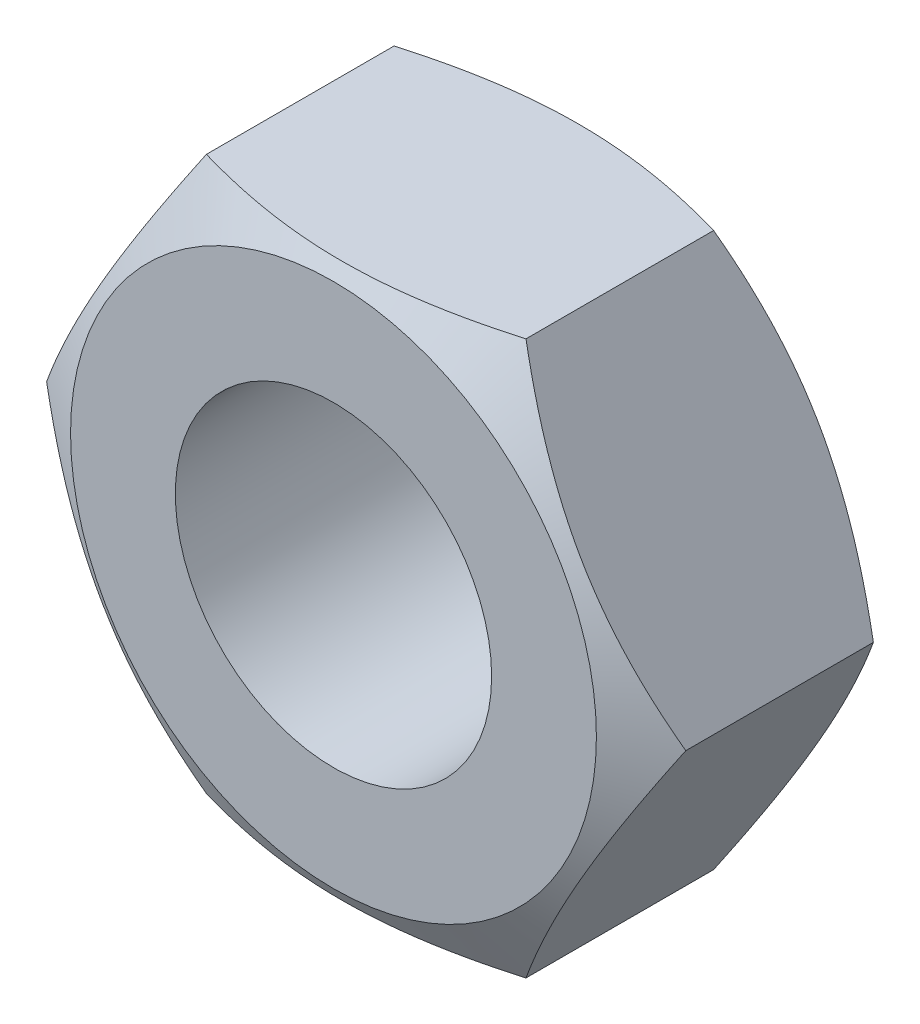
ISO-10303-21;
HEADER;
FILE_DESCRIPTION(('STEP AP214'),'2;1');
FILE_NAME('part.step','',(''),(''),'','','');
FILE_SCHEMA(('AUTOMOTIVE_DESIGN { 1 0 10303 214 1 1 1 1 }'));
ENDSEC;
DATA;
#1=APPLICATION_CONTEXT('core data for automotive mechanical design processes');
#2=APPLICATION_PROTOCOL_DEFINITION('international standard','automotive_design',2000,#1);
#3=PRODUCT_CONTEXT('',#1,'mechanical');
#4=PRODUCT('Part','Part','',(#3));
#5=PRODUCT_RELATED_PRODUCT_CATEGORY('part','',(#4));
#6=PRODUCT_DEFINITION_FORMATION('','',#4);
#7=PRODUCT_DEFINITION_CONTEXT('part definition',#1,'design');
#8=PRODUCT_DEFINITION('design','',#6,#7);
#9=PRODUCT_DEFINITION_SHAPE('','',#8);
#10=(LENGTH_UNIT() NAMED_UNIT(*) SI_UNIT(.MILLI.,.METRE.));
#11=(NAMED_UNIT(*) PLANE_ANGLE_UNIT() SI_UNIT($,.RADIAN.));
#12=(NAMED_UNIT(*) SI_UNIT($,.STERADIAN.) SOLID_ANGLE_UNIT());
#13=UNCERTAINTY_MEASURE_WITH_UNIT(LENGTH_MEASURE(1.E-05),#10,'distance_accuracy_value','');
#14=(GEOMETRIC_REPRESENTATION_CONTEXT(3) GLOBAL_UNCERTAINTY_ASSIGNED_CONTEXT((#13)) GLOBAL_UNIT_ASSIGNED_CONTEXT((#10,
#11,#12)) REPRESENTATION_CONTEXT('',''));
#15=CARTESIAN_POINT('',(0.,0.,0.));
#16=DIRECTION('',(0.,0.,1.));
#17=DIRECTION('',(1.,0.,0.));
#18=AXIS2_PLACEMENT_3D('',#15,#16,#17);
#19=CARTESIAN_POINT('',(4.04145188432738,0.,-3.2));
#20=DIRECTION('',(0.866025403784439,0.5,0.));
#21=DIRECTION('',(-0.5,0.866025403784439,0.));
#22=AXIS2_PLACEMENT_3D('',#19,#20,#21);
#23=PLANE('',#22);
#24=CARTESIAN_POINT('',(4.04156735438122,-0.000200000000001401,-0.413710357801552));
#25=CARTESIAN_POINT('',(3.9527667384984,0.153607178452448,-0.362422086098165));
#26=CARTESIAN_POINT('',(3.86319960126198,0.308742010834422,-0.315777250924379));
#27=CARTESIAN_POINT('',(3.68251437287562,0.621698006576779,-0.234358172641531));
#28=CARTESIAN_POINT('',(3.59139307116725,0.779524730787494,-0.199612732692744));
#29=CARTESIAN_POINT('',(3.41027974688034,1.09322221038012,-0.145526324291018));
#30=CARTESIAN_POINT('',(3.32031559103708,1.24904469916069,-0.125825383368564));
#31=CARTESIAN_POINT('',(3.13996396008051,1.56142288720537,-0.102306429845437));
#32=CARTESIAN_POINT('',(3.04957714051106,1.71797745103423,-0.0984689416537477));
#33=CARTESIAN_POINT('',(2.88068384499777,2.01050921992099,-0.10645159898516));
#34=CARTESIAN_POINT('',(2.80215208834114,2.1465302124579,-0.116311731177789));
#35=CARTESIAN_POINT('',(2.64560020969753,2.41768602028899,-0.147562764007586));
#36=CARTESIAN_POINT('',(2.5675806292065,2.55281989768468,-0.16896434039398));
#37=CARTESIAN_POINT('',(2.41070596159678,2.82453479240518,-0.222466704988759));
#38=CARTESIAN_POINT('',(2.33187072981463,2.96108141927833,-0.254794291553269));
#39=CARTESIAN_POINT('',(2.17537608630783,3.2321380929445,-0.328165230916176));
#40=CARTESIAN_POINT('',(2.09771466960098,3.36665161246854,-0.369191343678048));
#41=CARTESIAN_POINT('',(2.02061047210985,3.5002,-0.413710357801553));
#42=B_SPLINE_CURVE_WITH_KNOTS('',3,(#24,#25,#26,#27,#28,#29,#30,#31,#32,#33,#34,#35,#36,#37,#38,
#39,#40,#41),.UNSPECIFIED.,.F.,.F.,(4,2,2,2,2,2,2,2,4),(0.,0.554793832886253,1.11092123814984,
1.65328467083218,2.19498204478403,2.6666513085086,3.13875761298267,3.6213361260051,
4.10296698719187),.UNSPECIFIED.);
#43=CARTESIAN_POINT('',(4.04145188432738,0.,-0.413643688277824));
#44=VERTEX_POINT('',#43);
#45=CARTESIAN_POINT('',(2.02072594216369,3.5,-0.413643688277825));
#46=VERTEX_POINT('',#45);
#47=EDGE_CURVE('E54',#44,#46,#42,.T.);
#48=ORIENTED_EDGE('',*,*,#47,.F.);
#49=DIRECTION('',(0.,0.,1.));
#50=VECTOR('',#49,1.);
#51=CARTESIAN_POINT('',(4.04145188432738,0.,-3.2));
#52=LINE('',#51,#50);
#53=CARTESIAN_POINT('',(4.04145188432738,0.,-2.78635631172218));
#54=VERTEX_POINT('',#53);
#55=EDGE_CURVE('E13',#54,#44,#52,.T.);
#56=ORIENTED_EDGE('',*,*,#55,.F.);
#57=CARTESIAN_POINT('',(4.04156735438122,-0.000200000000001387,-2.78628964219845));
#58=CARTESIAN_POINT('',(3.9527667384984,0.153607178452448,-2.83757791390184));
#59=CARTESIAN_POINT('',(3.86319960126198,0.308742010834422,-2.88422274907562));
#60=CARTESIAN_POINT('',(3.68251437287562,0.621698006576779,-2.96564182735847));
#61=CARTESIAN_POINT('',(3.59139307116725,0.779524730787494,-3.00038726730726));
#62=CARTESIAN_POINT('',(3.41027974688034,1.09322221038012,-3.05447367570898));
#63=CARTESIAN_POINT('',(3.32031559103708,1.24904469916069,-3.07417461663144));
#64=CARTESIAN_POINT('',(3.13996396008051,1.56142288720537,-3.09769357015456));
#65=CARTESIAN_POINT('',(3.04957714051106,1.71797745103423,-3.10153105834625));
#66=CARTESIAN_POINT('',(2.88068384499777,2.01050921992099,-3.09354840101484));
#67=CARTESIAN_POINT('',(2.80215208834114,2.1465302124579,-3.08368826882221));
#68=CARTESIAN_POINT('',(2.64560020969753,2.41768602028899,-3.05243723599241));
#69=CARTESIAN_POINT('',(2.56758062920649,2.55281989768468,-3.03103565960602));
#70=CARTESIAN_POINT('',(2.41070596159678,2.82453479240518,-2.97753329501124));
#71=CARTESIAN_POINT('',(2.33187072981463,2.96108141927833,-2.94520570844673));
#72=CARTESIAN_POINT('',(2.17537608630783,3.2321380929445,-2.87183476908382));
#73=CARTESIAN_POINT('',(2.09771466960098,3.36665161246854,-2.83080865632195));
#74=CARTESIAN_POINT('',(2.02061047210985,3.5002,-2.78628964219845));
#75=B_SPLINE_CURVE_WITH_KNOTS('',3,(#57,#58,#59,#60,#61,#62,#63,#64,#65,#66,#67,#68,#69,#70,#71,
#72,#73,#74),.UNSPECIFIED.,.F.,.F.,(4,2,2,2,2,2,2,2,4),(0.,0.554793832886253,1.11092123814984,
1.65328467083218,2.19498204478403,2.6666513085086,3.13875761298267,3.6213361260051,
4.10296698719187),.UNSPECIFIED.);
#76=CARTESIAN_POINT('',(2.02072594216369,3.5,-2.78635631172218));
#77=VERTEX_POINT('',#76);
#78=EDGE_CURVE('E123',#54,#77,#75,.T.);
#79=ORIENTED_EDGE('',*,*,#78,.T.);
#80=DIRECTION('',(0.,0.,1.));
#81=VECTOR('',#80,1.);
#82=CARTESIAN_POINT('',(2.02072594216369,3.5,-3.2));
#83=LINE('',#82,#81);
#84=EDGE_CURVE('E41',#77,#46,#83,.T.);
#85=ORIENTED_EDGE('',*,*,#84,.T.);
#86=EDGE_LOOP('',(#48,#56,#79,#85));
#87=FACE_BOUND('',#86,.T.);
#88=ADVANCED_FACE('F37',(#87),#23,.T.);
#89=CARTESIAN_POINT('',(2.02072594216369,-3.5,-3.2));
#90=DIRECTION('',(0.866025403784439,-0.5,0.));
#91=DIRECTION('',(0.5,0.866025403784439,0.));
#92=AXIS2_PLACEMENT_3D('',#89,#90,#91);
#93=PLANE('',#92);
#94=CARTESIAN_POINT('',(2.02061047210985,-3.5002,-0.413710357801553));
#95=CARTESIAN_POINT('',(2.10941108799267,-3.34639282154755,-0.362422086098166));
#96=CARTESIAN_POINT('',(2.19897822522909,-3.19125798916558,-0.315777250924379));
#97=CARTESIAN_POINT('',(2.37966345361545,-2.87830199342322,-0.234358172641531));
#98=CARTESIAN_POINT('',(2.47078475532382,-2.7204752692125,-0.199612732692744));
#99=CARTESIAN_POINT('',(2.65189807961073,-2.40677778961987,-0.145526324291019));
#100=CARTESIAN_POINT('',(2.74186223545399,-2.25095530083931,-0.125825383368564));
#101=CARTESIAN_POINT('',(2.92221386641055,-1.93857711279463,-0.102306429845437));
#102=CARTESIAN_POINT('',(3.01260068598001,-1.78202254896577,-0.0984689416537483));
#103=CARTESIAN_POINT('',(3.1814939814933,-1.48949078007901,-0.106451598985161));
#104=CARTESIAN_POINT('',(3.26002573814992,-1.3534697875421,-0.11631173117779));
#105=CARTESIAN_POINT('',(3.41657761679353,-1.08231397971101,-0.147562764007586));
#106=CARTESIAN_POINT('',(3.49459719728457,-0.947180102315319,-0.168964340393981));
#107=CARTESIAN_POINT('',(3.65147186489428,-0.675465207594818,-0.222466704988759));
#108=CARTESIAN_POINT('',(3.73030709667643,-0.538918580721666,-0.254794291553269));
#109=CARTESIAN_POINT('',(3.88680174018324,-0.2678619070555,-0.328165230916176));
#110=CARTESIAN_POINT('',(3.96446315689009,-0.133348387531465,-0.369191343678048));
#111=CARTESIAN_POINT('',(4.04156735438122,0.000199999999998272,-0.413710357801552));
#112=B_SPLINE_CURVE_WITH_KNOTS('',3,(#94,#95,#96,#97,#98,#99,#100,#101,#102,#103,#104,#105,#106,
#107,#108,#109,#110,#111),.UNSPECIFIED.,.F.,.F.,(4,2,2,2,2,2,2,2,4),(0.,0.554793832886254,
1.11092123814984,1.65328467083219,2.19498204478403,2.6666513085086,3.13875761298267,
3.62133612600509,4.10296698719187),.UNSPECIFIED.);
#113=CARTESIAN_POINT('',(2.02072594216369,-3.5,-0.413643688277825));
#114=VERTEX_POINT('',#113);
#115=EDGE_CURVE('E197',#114,#44,#112,.T.);
#116=ORIENTED_EDGE('',*,*,#115,.F.);
#117=DIRECTION('',(0.,0.,1.));
#118=VECTOR('',#117,1.);
#119=CARTESIAN_POINT('',(2.02072594216369,-3.5,-3.2));
#120=LINE('',#119,#118);
#121=CARTESIAN_POINT('',(2.02072594216369,-3.5,-2.78635631172218));
#122=VERTEX_POINT('',#121);
#123=EDGE_CURVE('E46',#122,#114,#120,.T.);
#124=ORIENTED_EDGE('',*,*,#123,.F.);
#125=CARTESIAN_POINT('',(2.02061047210985,-3.5002,-2.78628964219845));
#126=CARTESIAN_POINT('',(2.10941108799267,-3.34639282154755,-2.83757791390183));
#127=CARTESIAN_POINT('',(2.19897822522909,-3.19125798916558,-2.88422274907562));
#128=CARTESIAN_POINT('',(2.37966345361545,-2.87830199342322,-2.96564182735847));
#129=CARTESIAN_POINT('',(2.47078475532382,-2.7204752692125,-3.00038726730726));
#130=CARTESIAN_POINT('',(2.65189807961073,-2.40677778961987,-3.05447367570898));
#131=CARTESIAN_POINT('',(2.74186223545399,-2.25095530083931,-3.07417461663144));
#132=CARTESIAN_POINT('',(2.92221386641055,-1.93857711279463,-3.09769357015456));
#133=CARTESIAN_POINT('',(3.01260068598001,-1.78202254896577,-3.10153105834625));
#134=CARTESIAN_POINT('',(3.1814939814933,-1.48949078007901,-3.09354840101484));
#135=CARTESIAN_POINT('',(3.26002573814992,-1.35346978754209,-3.08368826882221));
#136=CARTESIAN_POINT('',(3.41657761679353,-1.08231397971101,-3.05243723599241));
#137=CARTESIAN_POINT('',(3.49459719728457,-0.947180102315318,-3.03103565960602));
#138=CARTESIAN_POINT('',(3.65147186489428,-0.675465207594818,-2.97753329501124));
#139=CARTESIAN_POINT('',(3.73030709667643,-0.538918580721666,-2.94520570844673));
#140=CARTESIAN_POINT('',(3.88680174018324,-0.2678619070555,-2.87183476908382));
#141=CARTESIAN_POINT('',(3.96446315689009,-0.133348387531465,-2.83080865632195));
#142=CARTESIAN_POINT('',(4.04156735438122,0.00019999999999828,-2.78628964219845));
#143=B_SPLINE_CURVE_WITH_KNOTS('',3,(#125,#126,#127,#128,#129,#130,#131,#132,#133,#134,#135,
#136,#137,#138,#139,#140,#141,#142),.UNSPECIFIED.,.F.,.F.,(4,2,2,2,2,2,2,2,4),(0.,
0.554793832886253,1.11092123814984,1.65328467083219,2.19498204478403,2.6666513085086,
3.13875761298267,3.62133612600509,4.10296698719187),.UNSPECIFIED.);
#144=EDGE_CURVE('E133',#122,#54,#143,.T.);
#145=ORIENTED_EDGE('',*,*,#144,.T.);
#146=ORIENTED_EDGE('',*,*,#55,.T.);
#147=EDGE_LOOP('',(#116,#124,#145,#146));
#148=FACE_BOUND('',#147,.T.);
#149=ADVANCED_FACE('F182',(#148),#93,.T.);
#150=CARTESIAN_POINT('',(2.02072594216369,-3.5,-3.2));
#151=DIRECTION('',(0.,1.,0.));
#152=DIRECTION('',(0.,0.,1.));
#153=AXIS2_PLACEMENT_3D('',#150,#151,#152);
#154=PLANE('',#153);
#155=ORIENTED_EDGE('',*,*,#123,.T.);
#156=CARTESIAN_POINT('',(-5.50115624921716,-3.5,-1.84473683088568));
#157=CARTESIAN_POINT('',(-5.3476336728648,-3.5,-1.76997306111353));
#158=CARTESIAN_POINT('',(-5.19376639336898,-3.5,-1.69590536818078));
#159=CARTESIAN_POINT('',(-4.88515934110991,-3.5,-1.54955229395094));
#160=CARTESIAN_POINT('',(-4.73041944168447,-3.5,-1.47726718003009));
#161=CARTESIAN_POINT('',(-4.41912167760108,-3.5,-1.33452141460849));
#162=CARTESIAN_POINT('',(-4.26255854262694,-3.5,-1.26407221808801));
#163=CARTESIAN_POINT('',(-3.94821210106243,-3.5,-1.12596137379611));
#164=CARTESIAN_POINT('',(-3.79042885049213,-3.5,-1.05829959893573));
#165=CARTESIAN_POINT('',(-3.46807643943082,-3.5,-0.924287699925451));
#166=CARTESIAN_POINT('',(-3.3034571173953,-3.5,-0.858057594815772));
#167=CARTESIAN_POINT('',(-2.9723198837569,-3.5,-0.73043491920668));
#168=CARTESIAN_POINT('',(-2.8058017655431,-3.5,-0.669042881006884));
#169=CARTESIAN_POINT('',(-2.4708904779313,-3.5,-0.552654162670015));
#170=CARTESIAN_POINT('',(-2.30250163386854,-3.5,-0.497645157822716));
#171=CARTESIAN_POINT('',(-1.96330962749539,-3.5,-0.395738864286392));
#172=CARTESIAN_POINT('',(-1.79250721990682,-3.5,-0.348839098007306));
#173=CARTESIAN_POINT('',(-1.44932740892957,-3.5,-0.2655998480158));
#174=CARTESIAN_POINT('',(-1.27696441523268,-3.5,-0.22920202853296));
#175=CARTESIAN_POINT('',(-0.930020617319458,-3.5,-0.168980201444807));
#176=CARTESIAN_POINT('',(-0.755440055628397,-3.5,-0.145154830768674));
#177=CARTESIAN_POINT('',(-0.407243015779085,-3.5,-0.112286817944737));
#178=CARTESIAN_POINT('',(-0.233645486070466,-3.5,-0.103048400596316));
#179=CARTESIAN_POINT('',(0.113716830816676,-3.5,-0.0996172902111872));
#180=CARTESIAN_POINT('',(0.287481620993976,-3.5,-0.105424872149712));
#181=CARTESIAN_POINT('',(0.580305233678667,-3.5,-0.127472011241998));
#182=CARTESIAN_POINT('',(0.699667745924248,-3.5,-0.13993112208113));
#183=CARTESIAN_POINT('',(0.937561543720228,-3.5,-0.171212436351545));
#184=CARTESIAN_POINT('',(1.05609272265379,-3.5,-0.190035441240741));
#185=CARTESIAN_POINT('',(1.41025338003126,-3.5,-0.255065247422504));
#186=CARTESIAN_POINT('',(1.64433262324659,-3.5,-0.309822792842579));
#187=CARTESIAN_POINT('',(1.99453877839216,-3.5,-0.405337131297455));
#188=CARTESIAN_POINT('',(2.11246419958789,-3.5,-0.439879807775024));
#189=CARTESIAN_POINT('',(2.34717049010381,-3.5,-0.51269045545613));
#190=CARTESIAN_POINT('',(2.46395135052355,-3.5,-0.55095845560369));
#191=CARTESIAN_POINT('',(2.69640457328686,-3.5,-0.630594214996989));
#192=CARTESIAN_POINT('',(2.81207724001543,-3.5,-0.671961093847517));
#193=CARTESIAN_POINT('',(3.04245347185405,-3.5,-0.757294159401781));
#194=CARTESIAN_POINT('',(3.1571570599908,-3.5,-0.801260284144007));
#195=CARTESIAN_POINT('',(3.46931126694017,-3.5,-0.924319255228568));
#196=CARTESIAN_POINT('',(3.66590695020371,-3.5,-1.00557883026604));
#197=CARTESIAN_POINT('',(4.05704930952244,-3.5,-1.1729056588535));
#198=CARTESIAN_POINT('',(4.2515957466712,-3.5,-1.25897346574537));
#199=CARTESIAN_POINT('',(4.63911117704857,-3.5,-1.43475956031312));
#200=CARTESIAN_POINT('',(4.83207957744655,-3.5,-1.52447915045944));
#201=CARTESIAN_POINT('',(5.21670495668282,-3.5,-1.7066924718098));
#202=CARTESIAN_POINT('',(5.4083618943509,-3.5,-1.79918628961779));
#203=CARTESIAN_POINT('',(5.79092387380511,-3.5,-1.98648090525235));
#204=CARTESIAN_POINT('',(5.9818272182036,-3.5,-2.08128516292866));
#205=CARTESIAN_POINT('',(6.36277354694897,-3.5,-2.27260856107736));
#206=CARTESIAN_POINT('',(6.55281652212027,-3.5,-2.36912771978486));
#207=CARTESIAN_POINT('',(7.12181016880401,-3.5,-2.66068280806845));
#208=CARTESIAN_POINT('',(7.49971427222889,-3.5,-2.85776020924556));
#209=CARTESIAN_POINT('',(8.21300668949877,-3.5,-3.23411222750771));
#210=CARTESIAN_POINT('',(8.54859045797656,-3.5,-3.41301819794599));
#211=CARTESIAN_POINT('',(9.21864733149538,-3.5,-3.7729481401649));
#212=CARTESIAN_POINT('',(9.55312036410149,-3.5,-3.95397224672469));
#213=CARTESIAN_POINT('',(10.2200787447813,-3.5,-4.31696642021118));
#214=CARTESIAN_POINT('',(10.5525669849172,-3.5,-4.49893118160394));
#215=CARTESIAN_POINT('',(11.2168509819932,-3.5,-4.86405747964854));
#216=CARTESIAN_POINT('',(11.5486467927042,-3.5,-5.04721891843398));
#217=CARTESIAN_POINT('',(11.880200313743,-3.5,-5.23081522044545));
#218=B_SPLINE_CURVE_WITH_KNOTS('',3,(#156,#157,#158,#159,#160,#161,#162,#163,#164,#165,#166,
#167,#168,#169,#170,#171,#172,#173,#174,#175,#176,#177,#178,#179,#180,#181,#182,#183,#184,#185,
#186,#187,#188,#189,#190,#191,#192,#193,#194,#195,#196,#197,#198,#199,#200,#201,#202,#203,#204,
#205,#206,#207,#208,#209,#210,#211,#212,#213,#214,#215,#216,#217),.UNSPECIFIED.,.F.,.F.,(4,2,2,
2,2,2,2,2,2,2,2,2,2,2,2,2,2,2,2,2,2,2,2,2,2,2,2,2,2,2,4),(0.,0.512284382394356,1.02464514269634,
1.5396728010515,2.05467695132554,2.58694654067135,3.11927461049869,3.65055709853561,
4.1816769775809,4.70978716815933,5.2378400906927,5.75874373693319,6.2796569030872,
6.63951680132746,6.9994220365988,7.71958424767873,8.08819224525978,8.4568031069813,
8.82530964019227,9.19380739238647,9.83189324883165,10.4700526894767,11.1084417700218,
11.7468508001481,12.3862830201293,13.0257220434787,14.3043032399922,15.4451787224182,
16.5861271990276,17.7231982172802,18.8601773796741),.UNSPECIFIED.);
#219=CARTESIAN_POINT('',(-2.02072594216369,-3.5,-0.413643688277825));
#220=VERTEX_POINT('',#219);
#221=EDGE_CURVE('E189',#114,#220,#218,.F.);
#222=ORIENTED_EDGE('',*,*,#221,.T.);
#223=DIRECTION('',(0.,0.,1.));
#224=VECTOR('',#223,1.);
#225=CARTESIAN_POINT('',(-2.02072594216369,-3.5,-3.2));
#226=LINE('',#225,#224);
#227=CARTESIAN_POINT('',(-2.02072594216369,-3.5,-2.78635631172218));
#228=VERTEX_POINT('',#227);
#229=EDGE_CURVE('E112',#228,#220,#226,.T.);
#230=ORIENTED_EDGE('',*,*,#229,.F.);
#231=CARTESIAN_POINT('',(-5.50115624921716,-3.5,-1.35526316911432));
#232=CARTESIAN_POINT('',(-5.3476336728648,-3.5,-1.43002693888647));
#233=CARTESIAN_POINT('',(-5.19376639336898,-3.5,-1.50409463181922));
#234=CARTESIAN_POINT('',(-4.88515934110991,-3.5,-1.65044770604906));
#235=CARTESIAN_POINT('',(-4.73041944168447,-3.5,-1.72273281996991));
#236=CARTESIAN_POINT('',(-4.41912167760108,-3.5,-1.86547858539151));
#237=CARTESIAN_POINT('',(-4.26255854262694,-3.5,-1.93592778191199));
#238=CARTESIAN_POINT('',(-3.94821210106243,-3.5,-2.07403862620389));
#239=CARTESIAN_POINT('',(-3.79042885049213,-3.5,-2.14170040106427));
#240=CARTESIAN_POINT('',(-3.46807643943082,-3.5,-2.27571230007455));
#241=CARTESIAN_POINT('',(-3.3034571173953,-3.5,-2.34194240518423));
#242=CARTESIAN_POINT('',(-2.9723198837569,-3.5,-2.46956508079332));
#243=CARTESIAN_POINT('',(-2.8058017655431,-3.5,-2.53095711899312));
#244=CARTESIAN_POINT('',(-2.4708904779313,-3.5,-2.64734583732998));
#245=CARTESIAN_POINT('',(-2.30250163386854,-3.5,-2.70235484217728));
#246=CARTESIAN_POINT('',(-1.96330962749539,-3.5,-2.80426113571361));
#247=CARTESIAN_POINT('',(-1.79250721990682,-3.5,-2.85116090199269));
#248=CARTESIAN_POINT('',(-1.44932740892957,-3.5,-2.9344001519842));
#249=CARTESIAN_POINT('',(-1.27696441523268,-3.5,-2.97079797146704));
#250=CARTESIAN_POINT('',(-0.930020617319458,-3.5,-3.03101979855519));
#251=CARTESIAN_POINT('',(-0.755440055628397,-3.5,-3.05484516923133));
#252=CARTESIAN_POINT('',(-0.407243015779085,-3.5,-3.08771318205526));
#253=CARTESIAN_POINT('',(-0.233645486070466,-3.5,-3.09695159940368));
#254=CARTESIAN_POINT('',(0.113716830816676,-3.5,-3.10038270978881));
#255=CARTESIAN_POINT('',(0.287481620993976,-3.5,-3.09457512785029));
#256=CARTESIAN_POINT('',(0.580305233678667,-3.5,-3.072527988758));
#257=CARTESIAN_POINT('',(0.699667745924248,-3.5,-3.06006887791887));
#258=CARTESIAN_POINT('',(0.937561543720228,-3.5,-3.02878756364846));
#259=CARTESIAN_POINT('',(1.05609272265379,-3.5,-3.00996455875926));
#260=CARTESIAN_POINT('',(1.41025338003126,-3.5,-2.9449347525775));
#261=CARTESIAN_POINT('',(1.64433262324659,-3.5,-2.89017720715742));
#262=CARTESIAN_POINT('',(1.99453877839216,-3.5,-2.79466286870254));
#263=CARTESIAN_POINT('',(2.11246419958789,-3.5,-2.76012019222498));
#264=CARTESIAN_POINT('',(2.34717049010381,-3.5,-2.68730954454387));
#265=CARTESIAN_POINT('',(2.46395135052354,-3.5,-2.64904154439631));
#266=CARTESIAN_POINT('',(2.69640457328685,-3.5,-2.56940578500301));
#267=CARTESIAN_POINT('',(2.81207724001543,-3.5,-2.52803890615248));
#268=CARTESIAN_POINT('',(3.04245347185405,-3.5,-2.44270584059822));
#269=CARTESIAN_POINT('',(3.1571570599908,-3.5,-2.39873971585599));
#270=CARTESIAN_POINT('',(3.46931126694017,-3.5,-2.27568074477143));
#271=CARTESIAN_POINT('',(3.66590695020371,-3.5,-2.19442116973396));
#272=CARTESIAN_POINT('',(4.05704930952244,-3.5,-2.0270943411465));
#273=CARTESIAN_POINT('',(4.2515957466712,-3.5,-1.94102653425463));
#274=CARTESIAN_POINT('',(4.63911117704857,-3.5,-1.76524043968688));
#275=CARTESIAN_POINT('',(4.83207957744655,-3.5,-1.67552084954056));
#276=CARTESIAN_POINT('',(5.21670495668282,-3.5,-1.4933075281902));
#277=CARTESIAN_POINT('',(5.4083618943509,-3.5,-1.40081371038221));
#278=CARTESIAN_POINT('',(5.79092387380511,-3.5,-1.21351909474765));
#279=CARTESIAN_POINT('',(5.9818272182036,-3.5,-1.11871483707134));
#280=CARTESIAN_POINT('',(6.36277354694897,-3.5,-0.927391438922643));
#281=CARTESIAN_POINT('',(6.55281652212027,-3.5,-0.830872280215137));
#282=CARTESIAN_POINT('',(7.12181016880401,-3.5,-0.539317191931551));
#283=CARTESIAN_POINT('',(7.49971427222889,-3.5,-0.342239790754438));
#284=CARTESIAN_POINT('',(8.21300668949877,-3.5,0.0341122275077085));
#285=CARTESIAN_POINT('',(8.54859045797656,-3.5,0.213018197945989));
#286=CARTESIAN_POINT('',(9.21864733149538,-3.5,0.572948140164896));
#287=CARTESIAN_POINT('',(9.55312036410149,-3.5,0.75397224672469));
#288=CARTESIAN_POINT('',(10.2200787447813,-3.5,1.11696642021118));
#289=CARTESIAN_POINT('',(10.5525669849172,-3.5,1.29893118160394));
#290=CARTESIAN_POINT('',(11.2168509819932,-3.5,1.66405747964854));
#291=CARTESIAN_POINT('',(11.5486467927042,-3.5,1.84721891843398));
#292=CARTESIAN_POINT('',(11.880200313743,-3.5,2.03081522044545));
#293=B_SPLINE_CURVE_WITH_KNOTS('',3,(#231,#232,#233,#234,#235,#236,#237,#238,#239,#240,#241,
#242,#243,#244,#245,#246,#247,#248,#249,#250,#251,#252,#253,#254,#255,#256,#257,#258,#259,#260,
#261,#262,#263,#264,#265,#266,#267,#268,#269,#270,#271,#272,#273,#274,#275,#276,#277,#278,#279,
#280,#281,#282,#283,#284,#285,#286,#287,#288,#289,#290,#291,#292),.UNSPECIFIED.,.F.,.F.,(4,2,2,
2,2,2,2,2,2,2,2,2,2,2,2,2,2,2,2,2,2,2,2,2,2,2,2,2,2,2,4),(0.,0.512284382394357,1.02464514269634,
1.53967280105151,2.05467695132554,2.58694654067135,3.11927461049869,3.6505570985356,
4.18167697758089,4.70978716815933,5.2378400906927,5.75874373693319,6.27965690308719,
6.63951680132746,6.9994220365988,7.71958424767873,8.08819224525978,8.4568031069813,
8.82530964019227,9.19380739238647,9.83189324883165,10.4700526894767,11.1084417700218,
11.7468508001481,12.3862830201293,13.0257220434787,14.3043032399922,15.4451787224182,
16.5861271990276,17.7231982172802,18.8601773796741),.UNSPECIFIED.);
#294=EDGE_CURVE('E172',#122,#228,#293,.F.);
#295=ORIENTED_EDGE('',*,*,#294,.F.);
#296=EDGE_LOOP('',(#155,#222,#230,#295));
#297=FACE_BOUND('',#296,.T.);
#298=ADVANCED_FACE('F178',(#297),#154,.F.);
#299=CARTESIAN_POINT('',(-4.04145188432738,0.,-3.2));
#300=DIRECTION('',(-0.866025403784439,-0.5,0.));
#301=DIRECTION('',(0.5,-0.866025403784439,0.));
#302=AXIS2_PLACEMENT_3D('',#299,#300,#301);
#303=PLANE('',#302);
#304=CARTESIAN_POINT('',(-4.04156735438122,0.000199999999998705,-0.413710357801552));
#305=CARTESIAN_POINT('',(-3.9527667384984,-0.153607178452451,-0.362422086098165));
#306=CARTESIAN_POINT('',(-3.86319960126198,-0.308742010834425,-0.315777250924378));
#307=CARTESIAN_POINT('',(-3.68251437287562,-0.621698006576782,-0.234358172641531));
#308=CARTESIAN_POINT('',(-3.59139307116725,-0.779524730787497,-0.199612732692744));
#309=CARTESIAN_POINT('',(-3.41027974688033,-1.09322221038013,-0.145526324291019));
#310=CARTESIAN_POINT('',(-3.32031559103708,-1.24904469916069,-0.125825383368564));
#311=CARTESIAN_POINT('',(-3.13996396008051,-1.56142288720537,-0.102306429845437));
#312=CARTESIAN_POINT('',(-3.04957714051106,-1.71797745103423,-0.0984689416537482));
#313=CARTESIAN_POINT('',(-2.88068384499777,-2.01050921992099,-0.106451598985161));
#314=CARTESIAN_POINT('',(-2.80215208834114,-2.14653021245791,-0.11631173117779));
#315=CARTESIAN_POINT('',(-2.64560020969753,-2.41768602028899,-0.147562764007586));
#316=CARTESIAN_POINT('',(-2.56758062920649,-2.55281989768468,-0.168964340393981));
#317=CARTESIAN_POINT('',(-2.41070596159678,-2.82453479240518,-0.222466704988759));
#318=CARTESIAN_POINT('',(-2.33187072981463,-2.96108141927834,-0.254794291553269));
#319=CARTESIAN_POINT('',(-2.17537608630783,-3.2321380929445,-0.328165230916177));
#320=CARTESIAN_POINT('',(-2.09771466960098,-3.36665161246854,-0.369191343678049));
#321=CARTESIAN_POINT('',(-2.02061047210985,-3.5002,-0.413710357801553));
#322=B_SPLINE_CURVE_WITH_KNOTS('',3,(#304,#305,#306,#307,#308,#309,#310,#311,#312,#313,#314,
#315,#316,#317,#318,#319,#320,#321),.UNSPECIFIED.,.F.,.F.,(4,2,2,2,2,2,2,2,4),(0.,
0.554793832886253,1.11092123814984,1.65328467083219,2.19498204478403,2.6666513085086,
3.13875761298267,3.62133612600509,4.10296698719187),.UNSPECIFIED.);
#323=CARTESIAN_POINT('',(-4.04145188432738,0.,-0.413643688277824));
#324=VERTEX_POINT('',#323);
#325=EDGE_CURVE('E108',#324,#220,#322,.T.);
#326=ORIENTED_EDGE('',*,*,#325,.F.);
#327=DIRECTION('',(0.,0.,1.));
#328=VECTOR('',#327,1.);
#329=CARTESIAN_POINT('',(-4.04145188432738,0.,-3.2));
#330=LINE('',#329,#328);
#331=CARTESIAN_POINT('',(-4.04145188432738,0.,-2.78635631172218));
#332=VERTEX_POINT('',#331);
#333=EDGE_CURVE('E107',#332,#324,#330,.T.);
#334=ORIENTED_EDGE('',*,*,#333,.F.);
#335=CARTESIAN_POINT('',(-4.04156735438122,0.00019999999999869,-2.78628964219845));
#336=CARTESIAN_POINT('',(-3.9527667384984,-0.153607178452451,-2.83757791390184));
#337=CARTESIAN_POINT('',(-3.86319960126198,-0.308742010834425,-2.88422274907562));
#338=CARTESIAN_POINT('',(-3.68251437287562,-0.621698006576782,-2.96564182735847));
#339=CARTESIAN_POINT('',(-3.59139307116725,-0.779524730787497,-3.00038726730726));
#340=CARTESIAN_POINT('',(-3.41027974688033,-1.09322221038013,-3.05447367570898));
#341=CARTESIAN_POINT('',(-3.32031559103708,-1.24904469916069,-3.07417461663144));
#342=CARTESIAN_POINT('',(-3.13996396008051,-1.56142288720537,-3.09769357015456));
#343=CARTESIAN_POINT('',(-3.04957714051106,-1.71797745103423,-3.10153105834625));
#344=CARTESIAN_POINT('',(-2.88068384499777,-2.01050921992099,-3.09354840101484));
#345=CARTESIAN_POINT('',(-2.80215208834114,-2.14653021245791,-3.08368826882221));
#346=CARTESIAN_POINT('',(-2.64560020969753,-2.41768602028899,-3.05243723599241));
#347=CARTESIAN_POINT('',(-2.56758062920649,-2.55281989768468,-3.03103565960602));
#348=CARTESIAN_POINT('',(-2.41070596159678,-2.82453479240518,-2.97753329501124));
#349=CARTESIAN_POINT('',(-2.33187072981463,-2.96108141927834,-2.94520570844673));
#350=CARTESIAN_POINT('',(-2.17537608630783,-3.2321380929445,-2.87183476908382));
#351=CARTESIAN_POINT('',(-2.09771466960098,-3.36665161246854,-2.83080865632195));
#352=CARTESIAN_POINT('',(-2.02061047210985,-3.5002,-2.78628964219845));
#353=B_SPLINE_CURVE_WITH_KNOTS('',3,(#335,#336,#337,#338,#339,#340,#341,#342,#343,#344,#345,
#346,#347,#348,#349,#350,#351,#352),.UNSPECIFIED.,.F.,.F.,(4,2,2,2,2,2,2,2,4),(0.,
0.554793832886253,1.11092123814984,1.65328467083219,2.19498204478403,2.6666513085086,
3.13875761298267,3.62133612600509,4.10296698719187),.UNSPECIFIED.);
#354=EDGE_CURVE('E166',#332,#228,#353,.T.);
#355=ORIENTED_EDGE('',*,*,#354,.T.);
#356=ORIENTED_EDGE('',*,*,#229,.T.);
#357=EDGE_LOOP('',(#326,#334,#355,#356));
#358=FACE_BOUND('',#357,.T.);
#359=ADVANCED_FACE('F181',(#358),#303,.T.);
#360=CARTESIAN_POINT('',(-2.02072594216369,3.5,-3.2));
#361=DIRECTION('',(-0.866025403784439,0.5,0.));
#362=DIRECTION('',(-0.5,-0.866025403784439,0.));
#363=AXIS2_PLACEMENT_3D('',#360,#361,#362);
#364=PLANE('',#363);
#365=CARTESIAN_POINT('',(-2.02061047210985,3.5002,-0.413710357801553));
#366=CARTESIAN_POINT('',(-2.10941108799267,3.34639282154755,-0.362422086098165));
#367=CARTESIAN_POINT('',(-2.19897822522909,3.19125798916558,-0.315777250924379));
#368=CARTESIAN_POINT('',(-2.37966345361545,2.87830199342322,-0.234358172641531));
#369=CARTESIAN_POINT('',(-2.47078475532382,2.7204752692125,-0.199612732692744));
#370=CARTESIAN_POINT('',(-2.65189807961073,2.40677778961987,-0.145526324291018));
#371=CARTESIAN_POINT('',(-2.74186223545399,2.25095530083931,-0.125825383368564));
#372=CARTESIAN_POINT('',(-2.92221386641055,1.93857711279463,-0.102306429845437));
#373=CARTESIAN_POINT('',(-3.01260068598001,1.78202254896577,-0.0984689416537477));
#374=CARTESIAN_POINT('',(-3.1814939814933,1.48949078007901,-0.10645159898516));
#375=CARTESIAN_POINT('',(-3.26002573814992,1.35346978754209,-0.116311731177789));
#376=CARTESIAN_POINT('',(-3.41657761679353,1.08231397971101,-0.147562764007585));
#377=CARTESIAN_POINT('',(-3.49459719728457,0.947180102315317,-0.16896434039398));
#378=CARTESIAN_POINT('',(-3.65147186489428,0.675465207594815,-0.222466704988759));
#379=CARTESIAN_POINT('',(-3.73030709667643,0.538918580721663,-0.254794291553268));
#380=CARTESIAN_POINT('',(-3.88680174018324,0.267861907055497,-0.328165230916175));
#381=CARTESIAN_POINT('',(-3.96446315689008,0.133348387531462,-0.369191343678048));
#382=CARTESIAN_POINT('',(-4.04156735438122,-0.000200000000001569,-0.413710357801552));
#383=B_SPLINE_CURVE_WITH_KNOTS('',3,(#365,#366,#367,#368,#369,#370,#371,#372,#373,#374,#375,
#376,#377,#378,#379,#380,#381,#382),.UNSPECIFIED.,.F.,.F.,(4,2,2,2,2,2,2,2,4),(0.,
0.554793832886253,1.11092123814984,1.65328467083218,2.19498204478403,2.6666513085086,
3.13875761298267,3.6213361260051,4.10296698719187),.UNSPECIFIED.);
#384=CARTESIAN_POINT('',(-2.02072594216388,3.5,-0.413643688277698));
#385=VERTEX_POINT('',#384);
#386=EDGE_CURVE('E93',#385,#324,#383,.T.);
#387=ORIENTED_EDGE('',*,*,#386,.F.);
#388=DIRECTION('',(0.,0.,1.));
#389=VECTOR('',#388,1.);
#390=CARTESIAN_POINT('',(-2.02072594216369,3.5,-3.2));
#391=LINE('',#390,#389);
#392=CARTESIAN_POINT('',(-2.02072594216369,3.5,-2.78635631172218));
#393=VERTEX_POINT('',#392);
#394=EDGE_CURVE('E105',#393,#385,#391,.T.);
#395=ORIENTED_EDGE('',*,*,#394,.F.);
#396=CARTESIAN_POINT('',(-2.02061047210985,3.5002,-2.78628964219845));
#397=CARTESIAN_POINT('',(-2.10941108799267,3.34639282154755,-2.83757791390183));
#398=CARTESIAN_POINT('',(-2.19897822522909,3.19125798916558,-2.88422274907562));
#399=CARTESIAN_POINT('',(-2.37966345361545,2.87830199342322,-2.96564182735847));
#400=CARTESIAN_POINT('',(-2.47078475532382,2.7204752692125,-3.00038726730726));
#401=CARTESIAN_POINT('',(-2.65189807961073,2.40677778961987,-3.05447367570898));
#402=CARTESIAN_POINT('',(-2.74186223545399,2.25095530083931,-3.07417461663144));
#403=CARTESIAN_POINT('',(-2.92221386641055,1.93857711279463,-3.09769357015456));
#404=CARTESIAN_POINT('',(-3.01260068598001,1.78202254896577,-3.10153105834625));
#405=CARTESIAN_POINT('',(-3.1814939814933,1.48949078007901,-3.09354840101484));
#406=CARTESIAN_POINT('',(-3.26002573814992,1.35346978754209,-3.08368826882221));
#407=CARTESIAN_POINT('',(-3.41657761679353,1.08231397971101,-3.05243723599241));
#408=CARTESIAN_POINT('',(-3.49459719728457,0.947180102315317,-3.03103565960602));
#409=CARTESIAN_POINT('',(-3.65147186489428,0.675465207594816,-2.97753329501124));
#410=CARTESIAN_POINT('',(-3.73030709667643,0.538918580721663,-2.94520570844673));
#411=CARTESIAN_POINT('',(-3.88680174018324,0.267861907055497,-2.87183476908382));
#412=CARTESIAN_POINT('',(-3.96446315689008,0.133348387531462,-2.83080865632195));
#413=CARTESIAN_POINT('',(-4.04156735438122,-0.000200000000001572,-2.78628964219845));
#414=B_SPLINE_CURVE_WITH_KNOTS('',3,(#396,#397,#398,#399,#400,#401,#402,#403,#404,#405,#406,
#407,#408,#409,#410,#411,#412,#413),.UNSPECIFIED.,.F.,.F.,(4,2,2,2,2,2,2,2,4),(0.,
0.554793832886253,1.11092123814984,1.65328467083218,2.19498204478403,2.6666513085086,
3.13875761298267,3.6213361260051,4.10296698719187),.UNSPECIFIED.);
#415=EDGE_CURVE('E62',#393,#332,#414,.T.);
#416=ORIENTED_EDGE('',*,*,#415,.T.);
#417=ORIENTED_EDGE('',*,*,#333,.T.);
#418=EDGE_LOOP('',(#387,#395,#416,#417));
#419=FACE_BOUND('',#418,.T.);
#420=ADVANCED_FACE('F104',(#419),#364,.T.);
#421=CARTESIAN_POINT('',(2.02072594216369,3.5,-3.2));
#422=DIRECTION('',(0.,1.,0.));
#423=DIRECTION('',(0.,0.,1.));
#424=AXIS2_PLACEMENT_3D('',#421,#422,#423);
#425=PLANE('',#424);
#426=CARTESIAN_POINT('',(-5.50115624921716,3.5,-1.84473683088567));
#427=CARTESIAN_POINT('',(-5.3476336728648,3.5,-1.76997306111353));
#428=CARTESIAN_POINT('',(-5.19376639336898,3.5,-1.69590536818078));
#429=CARTESIAN_POINT('',(-4.88515934110991,3.5,-1.54955229395094));
#430=CARTESIAN_POINT('',(-4.73041944168447,3.5,-1.47726718003009));
#431=CARTESIAN_POINT('',(-4.41912167760108,3.5,-1.33452141460849));
#432=CARTESIAN_POINT('',(-4.26255854262694,3.5,-1.26407221808801));
#433=CARTESIAN_POINT('',(-3.94821210106243,3.5,-1.12596137379611));
#434=CARTESIAN_POINT('',(-3.79042885049213,3.5,-1.05829959893573));
#435=CARTESIAN_POINT('',(-3.46807643943081,3.5,-0.92428769992545));
#436=CARTESIAN_POINT('',(-3.3034571173953,3.5,-0.858057594815771));
#437=CARTESIAN_POINT('',(-2.9723198837569,3.5,-0.730434919206679));
#438=CARTESIAN_POINT('',(-2.80580176554309,3.5,-0.669042881006883));
#439=CARTESIAN_POINT('',(-2.47089047793129,3.5,-0.552654162670015));
#440=CARTESIAN_POINT('',(-2.30250163386854,3.5,-0.497645157822716));
#441=CARTESIAN_POINT('',(-1.96330962749539,3.5,-0.395738864286392));
#442=CARTESIAN_POINT('',(-1.79250721990682,3.5,-0.348839098007306));
#443=CARTESIAN_POINT('',(-1.44932740892957,3.5,-0.2655998480158));
#444=CARTESIAN_POINT('',(-1.27696441523268,3.5,-0.22920202853296));
#445=CARTESIAN_POINT('',(-0.930020617319457,3.5,-0.168980201444807));
#446=CARTESIAN_POINT('',(-0.755440055628397,3.5,-0.145154830768674));
#447=CARTESIAN_POINT('',(-0.407243015779086,3.5,-0.112286817944737));
#448=CARTESIAN_POINT('',(-0.233645486070467,3.5,-0.103048400596316));
#449=CARTESIAN_POINT('',(0.113716830816675,3.5,-0.0996172902111872));
#450=CARTESIAN_POINT('',(0.287481620993975,3.5,-0.105424872149712));
#451=CARTESIAN_POINT('',(0.580305233678667,3.5,-0.127472011241998));
#452=CARTESIAN_POINT('',(0.699667745924247,3.5,-0.13993112208113));
#453=CARTESIAN_POINT('',(0.937561543720228,3.5,-0.171212436351545));
#454=CARTESIAN_POINT('',(1.05609272265379,3.5,-0.190035441240741));
#455=CARTESIAN_POINT('',(1.41025338003126,3.5,-0.255065247422504));
#456=CARTESIAN_POINT('',(1.64433262324659,3.5,-0.309822792842579));
#457=CARTESIAN_POINT('',(1.99453877839216,3.5,-0.405337131297455));
#458=CARTESIAN_POINT('',(2.11246419958789,3.5,-0.439879807775024));
#459=CARTESIAN_POINT('',(2.34717049010381,3.5,-0.51269045545613));
#460=CARTESIAN_POINT('',(2.46395135052355,3.5,-0.55095845560369));
#461=CARTESIAN_POINT('',(2.69640457328685,3.5,-0.630594214996989));
#462=CARTESIAN_POINT('',(2.81207724001543,3.5,-0.671961093847516));
#463=CARTESIAN_POINT('',(3.04245347185405,3.5,-0.75729415940178));
#464=CARTESIAN_POINT('',(3.1571570599908,3.5,-0.801260284144007));
#465=CARTESIAN_POINT('',(3.46931126694017,3.5,-0.924319255228568));
#466=CARTESIAN_POINT('',(3.66590695020371,3.5,-1.00557883026604));
#467=CARTESIAN_POINT('',(4.05704930952244,3.5,-1.1729056588535));
#468=CARTESIAN_POINT('',(4.2515957466712,3.5,-1.25897346574537));
#469=CARTESIAN_POINT('',(4.63911117704857,3.5,-1.43475956031312));
#470=CARTESIAN_POINT('',(4.83207957744655,3.5,-1.52447915045944));
#471=CARTESIAN_POINT('',(5.21670495668282,3.5,-1.7066924718098));
#472=CARTESIAN_POINT('',(5.4083618943509,3.5,-1.79918628961779));
#473=CARTESIAN_POINT('',(5.79092387380511,3.5,-1.98648090525235));
#474=CARTESIAN_POINT('',(5.9818272182036,3.5,-2.08128516292866));
#475=CARTESIAN_POINT('',(6.36277354694897,3.5,-2.27260856107736));
#476=CARTESIAN_POINT('',(6.55281652212027,3.5,-2.36912771978486));
#477=CARTESIAN_POINT('',(7.12181016880401,3.5,-2.66068280806845));
#478=CARTESIAN_POINT('',(7.49971427222889,3.5,-2.85776020924556));
#479=CARTESIAN_POINT('',(8.21300668949877,3.5,-3.23411222750771));
#480=CARTESIAN_POINT('',(8.54859045797656,3.5,-3.41301819794599));
#481=CARTESIAN_POINT('',(9.21864733149538,3.5,-3.7729481401649));
#482=CARTESIAN_POINT('',(9.55312036410149,3.5,-3.95397224672469));
#483=CARTESIAN_POINT('',(10.2200787447813,3.5,-4.31696642021118));
#484=CARTESIAN_POINT('',(10.5525669849172,3.5,-4.49893118160394));
#485=CARTESIAN_POINT('',(11.2168509819932,3.5,-4.86405747964854));
#486=CARTESIAN_POINT('',(11.5486467927042,3.5,-5.04721891843398));
#487=CARTESIAN_POINT('',(11.880200313743,3.5,-5.23081522044545));
#488=B_SPLINE_CURVE_WITH_KNOTS('',3,(#426,#427,#428,#429,#430,#431,#432,#433,#434,#435,#436,
#437,#438,#439,#440,#441,#442,#443,#444,#445,#446,#447,#448,#449,#450,#451,#452,#453,#454,#455,
#456,#457,#458,#459,#460,#461,#462,#463,#464,#465,#466,#467,#468,#469,#470,#471,#472,#473,#474,
#475,#476,#477,#478,#479,#480,#481,#482,#483,#484,#485,#486,#487),.UNSPECIFIED.,.F.,.F.,(4,2,2,
2,2,2,2,2,2,2,2,2,2,2,2,2,2,2,2,2,2,2,2,2,2,2,2,2,2,2,4),(0.,0.512284382394357,1.02464514269634,
1.53967280105151,2.05467695132554,2.58694654067135,3.11927461049869,3.6505570985356,
4.18167697758089,4.70978716815933,5.23784009069269,5.75874373693319,6.27965690308719,
6.63951680132746,6.9994220365988,7.71958424767873,8.08819224525977,8.4568031069813,
8.82530964019227,9.19380739238647,9.83189324883165,10.4700526894767,11.1084417700218,
11.7468508001481,12.3862830201293,13.0257220434787,14.3043032399922,15.4451787224182,
16.5861271990276,17.7231982172802,18.8601773796741),.UNSPECIFIED.);
#489=EDGE_CURVE('E89',#46,#385,#488,.F.);
#490=ORIENTED_EDGE('',*,*,#489,.F.);
#491=ORIENTED_EDGE('',*,*,#84,.F.);
#492=CARTESIAN_POINT('',(-5.50115624921716,3.5,-1.35526316911433));
#493=CARTESIAN_POINT('',(-5.3476336728648,3.5,-1.43002693888647));
#494=CARTESIAN_POINT('',(-5.19376639336898,3.5,-1.50409463181922));
#495=CARTESIAN_POINT('',(-4.88515934110991,3.5,-1.65044770604906));
#496=CARTESIAN_POINT('',(-4.73041944168447,3.5,-1.72273281996991));
#497=CARTESIAN_POINT('',(-4.41912167760108,3.5,-1.86547858539151));
#498=CARTESIAN_POINT('',(-4.26255854262694,3.5,-1.93592778191199));
#499=CARTESIAN_POINT('',(-3.94821210106243,3.5,-2.07403862620389));
#500=CARTESIAN_POINT('',(-3.79042885049213,3.5,-2.14170040106427));
#501=CARTESIAN_POINT('',(-3.46807643943081,3.5,-2.27571230007455));
#502=CARTESIAN_POINT('',(-3.3034571173953,3.5,-2.34194240518423));
#503=CARTESIAN_POINT('',(-2.9723198837569,3.5,-2.46956508079332));
#504=CARTESIAN_POINT('',(-2.8058017655431,3.5,-2.53095711899312));
#505=CARTESIAN_POINT('',(-2.4708904779313,3.5,-2.64734583732998));
#506=CARTESIAN_POINT('',(-2.30250163386854,3.5,-2.70235484217728));
#507=CARTESIAN_POINT('',(-1.96330962749539,3.5,-2.80426113571361));
#508=CARTESIAN_POINT('',(-1.79250721990682,3.5,-2.85116090199269));
#509=CARTESIAN_POINT('',(-1.44932740892957,3.5,-2.9344001519842));
#510=CARTESIAN_POINT('',(-1.27696441523268,3.5,-2.97079797146704));
#511=CARTESIAN_POINT('',(-0.930020617319458,3.5,-3.03101979855519));
#512=CARTESIAN_POINT('',(-0.755440055628397,3.5,-3.05484516923133));
#513=CARTESIAN_POINT('',(-0.407243015779086,3.5,-3.08771318205526));
#514=CARTESIAN_POINT('',(-0.233645486070466,3.5,-3.09695159940368));
#515=CARTESIAN_POINT('',(0.113716830816676,3.5,-3.10038270978881));
#516=CARTESIAN_POINT('',(0.287481620993976,3.5,-3.09457512785029));
#517=CARTESIAN_POINT('',(0.580305233678667,3.5,-3.072527988758));
#518=CARTESIAN_POINT('',(0.699667745924248,3.5,-3.06006887791887));
#519=CARTESIAN_POINT('',(0.937561543720228,3.5,-3.02878756364845));
#520=CARTESIAN_POINT('',(1.05609272265379,3.5,-3.00996455875926));
#521=CARTESIAN_POINT('',(1.41025338003126,3.5,-2.9449347525775));
#522=CARTESIAN_POINT('',(1.64433262324659,3.5,-2.89017720715742));
#523=CARTESIAN_POINT('',(1.99453877839216,3.5,-2.79466286870254));
#524=CARTESIAN_POINT('',(2.11246419958789,3.5,-2.76012019222498));
#525=CARTESIAN_POINT('',(2.34717049010382,3.5,-2.68730954454387));
#526=CARTESIAN_POINT('',(2.46395135052355,3.5,-2.64904154439631));
#527=CARTESIAN_POINT('',(2.69640457328686,3.5,-2.56940578500301));
#528=CARTESIAN_POINT('',(2.81207724001544,3.5,-2.52803890615248));
#529=CARTESIAN_POINT('',(3.04245347185405,3.5,-2.44270584059822));
#530=CARTESIAN_POINT('',(3.1571570599908,3.5,-2.39873971585599));
#531=CARTESIAN_POINT('',(3.46931126694017,3.5,-2.27568074477143));
#532=CARTESIAN_POINT('',(3.66590695020371,3.5,-2.19442116973396));
#533=CARTESIAN_POINT('',(4.05704930952244,3.5,-2.0270943411465));
#534=CARTESIAN_POINT('',(4.2515957466712,3.5,-1.94102653425463));
#535=CARTESIAN_POINT('',(4.63911117704857,3.5,-1.76524043968688));
#536=CARTESIAN_POINT('',(4.83207957744655,3.5,-1.67552084954056));
#537=CARTESIAN_POINT('',(5.21670495668282,3.5,-1.4933075281902));
#538=CARTESIAN_POINT('',(5.4083618943509,3.5,-1.40081371038221));
#539=CARTESIAN_POINT('',(5.79092387380511,3.5,-1.21351909474765));
#540=CARTESIAN_POINT('',(5.9818272182036,3.5,-1.11871483707134));
#541=CARTESIAN_POINT('',(6.36277354694897,3.5,-0.927391438922643));
#542=CARTESIAN_POINT('',(6.55281652212027,3.5,-0.830872280215137));
#543=CARTESIAN_POINT('',(7.12181016880401,3.5,-0.539317191931551));
#544=CARTESIAN_POINT('',(7.49971427222889,3.5,-0.342239790754438));
#545=CARTESIAN_POINT('',(8.21300668949877,3.5,0.0341122275077084));
#546=CARTESIAN_POINT('',(8.54859045797656,3.5,0.21301819794599));
#547=CARTESIAN_POINT('',(9.21864733149538,3.5,0.572948140164898));
#548=CARTESIAN_POINT('',(9.55312036410149,3.5,0.753972246724691));
#549=CARTESIAN_POINT('',(10.2200787447813,3.5,1.11696642021118));
#550=CARTESIAN_POINT('',(10.5525669849172,3.5,1.29893118160394));
#551=CARTESIAN_POINT('',(11.2168509819932,3.5,1.66405747964854));
#552=CARTESIAN_POINT('',(11.5486467927042,3.5,1.84721891843398));
#553=CARTESIAN_POINT('',(11.880200313743,3.5,2.03081522044545));
#554=B_SPLINE_CURVE_WITH_KNOTS('',3,(#492,#493,#494,#495,#496,#497,#498,#499,#500,#501,#502,
#503,#504,#505,#506,#507,#508,#509,#510,#511,#512,#513,#514,#515,#516,#517,#518,#519,#520,#521,
#522,#523,#524,#525,#526,#527,#528,#529,#530,#531,#532,#533,#534,#535,#536,#537,#538,#539,#540,
#541,#542,#543,#544,#545,#546,#547,#548,#549,#550,#551,#552,#553),.UNSPECIFIED.,.F.,.F.,(4,2,2,
2,2,2,2,2,2,2,2,2,2,2,2,2,2,2,2,2,2,2,2,2,2,2,2,2,2,2,4),(0.,0.512284382394357,1.02464514269634,
1.53967280105151,2.05467695132554,2.58694654067135,3.11927461049869,3.6505570985356,
4.18167697758089,4.70978716815932,5.23784009069269,5.75874373693319,6.27965690308719,
6.63951680132746,6.9994220365988,7.71958424767873,8.08819224525978,8.4568031069813,
8.82530964019227,9.19380739238647,9.83189324883165,10.4700526894767,11.1084417700218,
11.7468508001481,12.3862830201293,13.0257220434787,14.3043032399922,15.4451787224182,
16.5861271990276,17.7231982172802,18.8601773796741),.UNSPECIFIED.);
#555=EDGE_CURVE('E111',#77,#393,#554,.F.);
#556=ORIENTED_EDGE('',*,*,#555,.T.);
#557=ORIENTED_EDGE('',*,*,#394,.T.);
#558=EDGE_LOOP('',(#490,#491,#556,#557));
#559=FACE_BOUND('',#558,.T.);
#560=ADVANCED_FACE('F110',(#559),#425,.T.);
#561=CARTESIAN_POINT('',(2.02072594216369,3.5,-3.2));
#562=DIRECTION('',(0.,0.,1.));
#563=DIRECTION('',(1.,0.,0.));
#564=AXIS2_PLACEMENT_3D('',#561,#562,#563);
#565=PLANE('',#564);
#566=CARTESIAN_POINT('',(0.,0.,-3.2));
#567=DIRECTION('',(0.,0.,1.));
#568=DIRECTION('',(1.,0.,0.));
#569=AXIS2_PLACEMENT_3D('',#566,#567,#568);
#570=CIRCLE('',#569,2.);
#571=CARTESIAN_POINT('',(2.,0.,-3.2));
#572=VERTEX_POINT('',#571);
#573=EDGE_CURVE('E114',#572,#572,#570,.T.);
#574=ORIENTED_EDGE('',*,*,#573,.T.);
#575=EDGE_LOOP('',(#574));
#576=FACE_BOUND('',#575,.T.);
#577=CARTESIAN_POINT('',(0.,0.,-3.2));
#578=DIRECTION('',(0.,0.,-1.));
#579=DIRECTION('',(-1.,0.,0.));
#580=AXIS2_PLACEMENT_3D('',#577,#578,#579);
#581=CIRCLE('',#580,3.325);
#582=CARTESIAN_POINT('',(-3.325,0.,-3.2));
#583=VERTEX_POINT('',#582);
#584=EDGE_CURVE('E211',#583,#583,#581,.T.);
#585=ORIENTED_EDGE('',*,*,#584,.T.);
#586=EDGE_LOOP('',(#585));
#587=FACE_BOUND('',#586,.T.);
#588=ADVANCED_FACE('F252',(#576,#587),#565,.F.);
#589=CARTESIAN_POINT('',(2.02072594216369,3.5,0.));
#590=DIRECTION('',(0.,0.,1.));
#591=DIRECTION('',(1.,0.,0.));
#592=AXIS2_PLACEMENT_3D('',#589,#590,#591);
#593=PLANE('',#592);
#594=CARTESIAN_POINT('',(0.,0.,0.));
#595=DIRECTION('',(0.,0.,-1.));
#596=DIRECTION('',(-1.,0.,0.));
#597=AXIS2_PLACEMENT_3D('',#594,#595,#596);
#598=CIRCLE('',#597,3.325);
#599=CARTESIAN_POINT('',(-3.325,0.,0.));
#600=VERTEX_POINT('',#599);
#601=EDGE_CURVE('E99',#600,#600,#598,.T.);
#602=ORIENTED_EDGE('',*,*,#601,.F.);
#603=EDGE_LOOP('',(#602));
#604=FACE_BOUND('',#603,.T.);
#605=CARTESIAN_POINT('',(0.,0.,0.));
#606=DIRECTION('',(0.,0.,1.));
#607=DIRECTION('',(1.,0.,0.));
#608=AXIS2_PLACEMENT_3D('',#605,#606,#607);
#609=CIRCLE('',#608,2.);
#610=CARTESIAN_POINT('',(2.,0.,0.));
#611=VERTEX_POINT('',#610);
#612=EDGE_CURVE('E120',#611,#611,#609,.T.);
#613=ORIENTED_EDGE('',*,*,#612,.F.);
#614=EDGE_LOOP('',(#613));
#615=FACE_BOUND('',#614,.T.);
#616=ADVANCED_FACE('F259',(#604,#615),#593,.T.);
#617=CARTESIAN_POINT('',(0.,0.,-3.2));
#618=DIRECTION('',(0.,0.,1.));
#619=DIRECTION('',(1.,0.,0.));
#620=AXIS2_PLACEMENT_3D('',#617,#618,#619);
#621=CYLINDRICAL_SURFACE('',#620,2.);
#622=ORIENTED_EDGE('',*,*,#573,.F.);
#623=EDGE_LOOP('',(#622));
#624=FACE_BOUND('',#623,.T.);
#625=ORIENTED_EDGE('',*,*,#612,.T.);
#626=EDGE_LOOP('',(#625));
#627=FACE_BOUND('',#626,.T.);
#628=ADVANCED_FACE('F145',(#624,#627),#621,.F.);
#629=CARTESIAN_POINT('',(0.,0.,-3.2));
#630=DIRECTION('',(0.,0.,1.));
#631=DIRECTION('',(-1.,0.,0.));
#632=AXIS2_PLACEMENT_3D('',#629,#630,#631);
#633=CONICAL_SURFACE('',#632,3.325,1.0471975511966);
#634=ORIENTED_EDGE('',*,*,#144,.F.);
#635=ORIENTED_EDGE('',*,*,#294,.T.);
#636=ORIENTED_EDGE('',*,*,#354,.F.);
#637=ORIENTED_EDGE('',*,*,#415,.F.);
#638=ORIENTED_EDGE('',*,*,#555,.F.);
#639=ORIENTED_EDGE('',*,*,#78,.F.);
#640=EDGE_LOOP('',(#634,#635,#636,#637,#638,#639));
#641=FACE_BOUND('',#640,.T.);
#642=ORIENTED_EDGE('',*,*,#584,.F.);
#643=EDGE_LOOP('',(#642));
#644=FACE_BOUND('',#643,.T.);
#645=ADVANCED_FACE('F140',(#641,#644),#633,.T.);
#646=CARTESIAN_POINT('',(0.,0.,0.));
#647=DIRECTION('',(0.,0.,-1.));
#648=DIRECTION('',(-1.,0.,0.));
#649=AXIS2_PLACEMENT_3D('',#646,#647,#648);
#650=CONICAL_SURFACE('',#649,3.325,1.0471975511966);
#651=ORIENTED_EDGE('',*,*,#47,.T.);
#652=ORIENTED_EDGE('',*,*,#489,.T.);
#653=ORIENTED_EDGE('',*,*,#386,.T.);
#654=ORIENTED_EDGE('',*,*,#325,.T.);
#655=ORIENTED_EDGE('',*,*,#221,.F.);
#656=ORIENTED_EDGE('',*,*,#115,.T.);
#657=EDGE_LOOP('',(#651,#652,#653,#654,#655,#656));
#658=FACE_BOUND('',#657,.T.);
#659=ORIENTED_EDGE('',*,*,#601,.T.);
#660=EDGE_LOOP('',(#659));
#661=FACE_BOUND('',#660,.T.);
#662=ADVANCED_FACE('F91',(#658,#661),#650,.T.);
#663=CLOSED_SHELL('',(#88,#149,#298,#359,#420,#560,#588,#616,#628,#645,#662));
#664=MANIFOLD_SOLID_BREP('B2',#663);
#665=ADVANCED_BREP_SHAPE_REPRESENTATION('',(#18,#664),#14);
#666=SHAPE_DEFINITION_REPRESENTATION(#9,#665);
ENDSEC;
END-ISO-10303-21;
